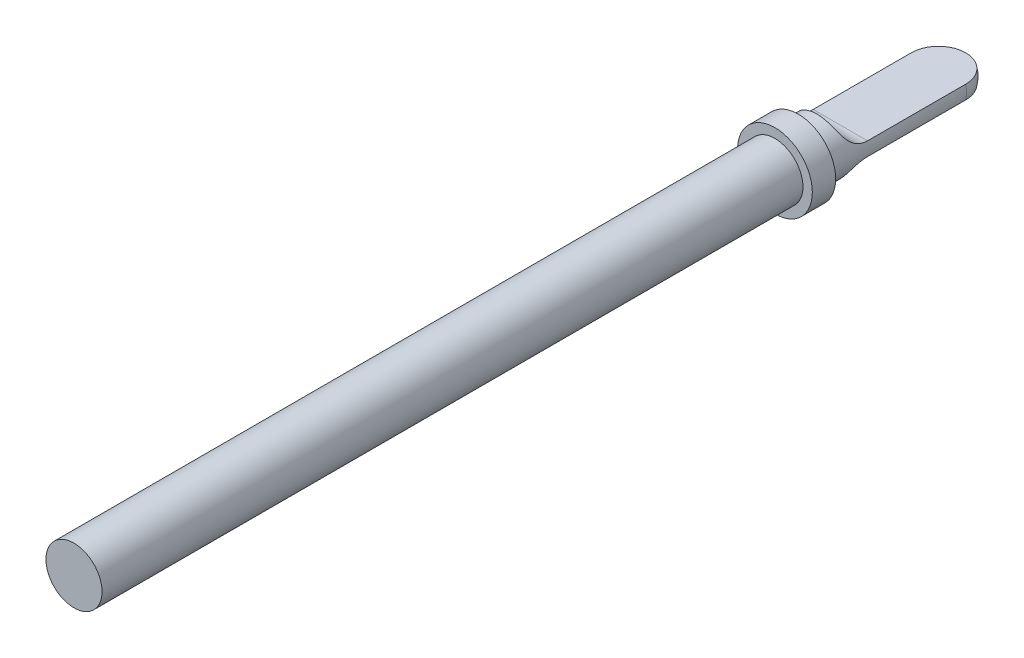
ISO-10303-21;
HEADER;
FILE_DESCRIPTION(('STEP AP214'),'2;1');
FILE_NAME('part.step','',(''),(''),'','','');
FILE_SCHEMA(('AUTOMOTIVE_DESIGN { 1 0 10303 214 1 1 1 1 }'));
ENDSEC;
DATA;
#1=APPLICATION_CONTEXT('core data for automotive mechanical design processes');
#2=APPLICATION_PROTOCOL_DEFINITION('international standard','automotive_design',2000,#1);
#3=PRODUCT_CONTEXT('',#1,'mechanical');
#4=PRODUCT('Part','Part','',(#3));
#5=PRODUCT_RELATED_PRODUCT_CATEGORY('part','',(#4));
#6=PRODUCT_DEFINITION_FORMATION('','',#4);
#7=PRODUCT_DEFINITION_CONTEXT('part definition',#1,'design');
#8=PRODUCT_DEFINITION('design','',#6,#7);
#9=PRODUCT_DEFINITION_SHAPE('','',#8);
#10=(LENGTH_UNIT() NAMED_UNIT(*) SI_UNIT(.MILLI.,.METRE.));
#11=(NAMED_UNIT(*) PLANE_ANGLE_UNIT() SI_UNIT($,.RADIAN.));
#12=(NAMED_UNIT(*) SI_UNIT($,.STERADIAN.) SOLID_ANGLE_UNIT());
#13=UNCERTAINTY_MEASURE_WITH_UNIT(LENGTH_MEASURE(1.E-05),#10,'distance_accuracy_value','');
#14=(GEOMETRIC_REPRESENTATION_CONTEXT(3) GLOBAL_UNCERTAINTY_ASSIGNED_CONTEXT((#13)) GLOBAL_UNIT_ASSIGNED_CONTEXT((#10,
#11,#12)) REPRESENTATION_CONTEXT('',''));
#15=CARTESIAN_POINT('',(0.,0.,0.));
#16=DIRECTION('',(0.,0.,1.));
#17=DIRECTION('',(1.,0.,0.));
#18=AXIS2_PLACEMENT_3D('',#15,#16,#17);
#19=CARTESIAN_POINT('',(0.,0.,-35.));
#20=DIRECTION('',(0.,0.,1.));
#21=DIRECTION('',(1.,0.,0.));
#22=AXIS2_PLACEMENT_3D('',#19,#20,#21);
#23=CYLINDRICAL_SURFACE('',#22,6.);
#24=CARTESIAN_POINT('',(0.,0.,-5.));
#25=DIRECTION('',(0.,0.,-1.));
#26=DIRECTION('',(-1.,0.,0.));
#27=AXIS2_PLACEMENT_3D('',#24,#25,#26);
#28=CIRCLE('',#27,6.);
#29=CARTESIAN_POINT('',(-6.,0.,-5.));
#30=VERTEX_POINT('',#29);
#31=EDGE_CURVE('E100',#30,#30,#28,.T.);
#32=ORIENTED_EDGE('',*,*,#31,.T.);
#33=EDGE_LOOP('',(#32));
#34=FACE_BOUND('',#33,.T.);
#35=DIRECTION('',(0.,0.,1.));
#36=VECTOR('',#35,1.);
#37=CARTESIAN_POINT('',(-5.81878883365728,1.46345362389977,-35.));
#38=LINE('',#37,#36);
#39=CARTESIAN_POINT('',(-5.81878883365728,1.46345362389977,-35.));
#40=VERTEX_POINT('',#39);
#41=CARTESIAN_POINT('',(-5.81878883365728,1.46345362389977,-14.));
#42=VERTEX_POINT('',#41);
#43=EDGE_CURVE('E110',#40,#42,#38,.T.);
#44=ORIENTED_EDGE('',*,*,#43,.F.);
#45=CARTESIAN_POINT('',(0.,0.,-35.));
#46=DIRECTION('',(0.,0.,-1.));
#47=DIRECTION('',(-1.,0.,0.));
#48=AXIS2_PLACEMENT_3D('',#45,#46,#47);
#49=CIRCLE('',#48,6.);
#50=CARTESIAN_POINT('',(-5.81878883365728,-1.46345362389977,-35.));
#51=VERTEX_POINT('',#50);
#52=EDGE_CURVE('E105',#51,#40,#49,.T.);
#53=ORIENTED_EDGE('',*,*,#52,.F.);
#54=DIRECTION('',(0.,0.,1.));
#55=VECTOR('',#54,1.);
#56=CARTESIAN_POINT('',(-5.81878883365728,-1.46345362389977,-35.));
#57=LINE('',#56,#55);
#58=CARTESIAN_POINT('',(-5.81878883365728,-1.46345362389977,-14.));
#59=VERTEX_POINT('',#58);
#60=EDGE_CURVE('E91',#51,#59,#57,.T.);
#61=ORIENTED_EDGE('',*,*,#60,.T.);
#62=CARTESIAN_POINT('',(-5.81878883365728,-1.46345362389977,-14.));
#63=CARTESIAN_POINT('',(-5.8187595476493,-1.46343780822699,-13.8666701122302));
#64=CARTESIAN_POINT('',(-5.81744658980762,-1.46878605701894,-13.7333389597626));
#65=CARTESIAN_POINT('',(-5.8120416416793,-1.49009946165884,-13.4675723092326));
#66=CARTESIAN_POINT('',(-5.80794939032216,-1.50606561488737,-13.3351368964912));
#67=CARTESIAN_POINT('',(-5.7967633962931,-1.54854418566397,-13.0718335312319));
#68=CARTESIAN_POINT('',(-5.78966392303702,-1.57507673280462,-12.9409690644975));
#69=CARTESIAN_POINT('',(-5.7720500693881,-1.6384524111705,-12.6819979503359));
#70=CARTESIAN_POINT('',(-5.76153582113528,-1.6752951434195,-12.5538911963992));
#71=CARTESIAN_POINT('',(-5.73652900901838,-1.75901776550554,-12.3011679838563));
#72=CARTESIAN_POINT('',(-5.72203018657739,-1.80591341977891,-12.17655735882));
#73=CARTESIAN_POINT('',(-5.68839211428598,-1.90922627106087,-11.93199837499));
#74=CARTESIAN_POINT('',(-5.66925313696443,-1.96564290881716,-11.8120497428647));
#75=CARTESIAN_POINT('',(-5.62560218144598,-2.08728730869278,-11.5779034359227));
#76=CARTESIAN_POINT('',(-5.60109655250726,-2.1525046240722,-11.4636991596871));
#77=CARTESIAN_POINT('',(-5.54590059206869,-2.29096864146265,-11.2418369515879));
#78=CARTESIAN_POINT('',(-5.51521061451099,-2.36421488385344,-11.1341786455446));
#79=CARTESIAN_POINT('',(-5.44817088347328,-2.51474779026046,-10.9302832552103));
#80=CARTESIAN_POINT('',(-5.41208287611321,-2.59177231269134,-10.8337666777137));
#81=CARTESIAN_POINT('',(-5.33283342342227,-2.75114577746289,-10.6483265680489));
#82=CARTESIAN_POINT('',(-5.28967219576762,-2.83349455590399,-10.5594028023422));
#83=CARTESIAN_POINT('',(-5.19579614800294,-3.00216767013363,-10.3897643360033));
#84=CARTESIAN_POINT('',(-5.14508446283719,-3.08849034573572,-10.3090462516741));
#85=CARTESIAN_POINT('',(-5.03577426401779,-3.26368373781016,-10.1561754622725));
#86=CARTESIAN_POINT('',(-4.97717620507416,-3.35255430714454,-10.0840222638196));
#87=CARTESIAN_POINT('',(-4.85666277825761,-3.52463093509877,-9.95350746791766));
#88=CARTESIAN_POINT('',(-4.79532149416031,-3.60776466918889,-9.8945184345673));
#89=CARTESIAN_POINT('',(-4.66586998095938,-3.7736888376187,-9.78394668237212));
#90=CARTESIAN_POINT('',(-4.59775953551006,-3.85647926089785,-9.73236420037319));
#91=CARTESIAN_POINT('',(-4.45498666796435,-4.02056245384197,-9.63636369761515));
#92=CARTESIAN_POINT('',(-4.38032338451525,-4.10185502491397,-9.59194662091345));
#93=CARTESIAN_POINT('',(-4.22479167079789,-4.26187589406231,-9.50988380364833));
#94=CARTESIAN_POINT('',(-4.14392297487824,-4.34060408215263,-9.47223835320667));
#95=CARTESIAN_POINT('',(-3.9742843872052,-4.49651748216085,-9.40232150720246));
#96=CARTESIAN_POINT('',(-3.88536616550119,-4.57361298322587,-9.37021054087888));
#97=CARTESIAN_POINT('',(-3.70194301399493,-4.72330798115938,-9.31189272290486));
#98=CARTESIAN_POINT('',(-3.6074362141302,-4.79590595622523,-9.28568786184329));
#99=CARTESIAN_POINT('',(-3.41338767390328,-4.93589921722036,-9.23848379784218));
#100=CARTESIAN_POINT('',(-3.31384510941901,-5.00329364698083,-9.2174854503083));
#101=CARTESIAN_POINT('',(-3.11027601245632,-5.132320188033,-9.17997941120446));
#102=CARTESIAN_POINT('',(-3.0062489567153,-5.19395162420962,-9.16347224532967));
#103=CARTESIAN_POINT('',(-2.77836250777054,-5.31978216342244,-9.13206092112397));
#104=CARTESIAN_POINT('',(-2.65386668958833,-5.38298276780505,-9.11776736555843));
#105=CARTESIAN_POINT('',(-2.40048371276678,-5.50065366533524,-9.09320590147829));
#106=CARTESIAN_POINT('',(-2.27159766021798,-5.55512613803728,-9.08293698701717));
#107=CARTESIAN_POINT('',(-2.01004063255206,-5.65502879146923,-9.0655270167213));
#108=CARTESIAN_POINT('',(-1.87736656855546,-5.70045133699281,-9.05838859596234));
#109=CARTESIAN_POINT('',(-1.60910641984213,-5.78190495866832,-9.04649783482034));
#110=CARTESIAN_POINT('',(-1.47352107373874,-5.81793838713376,-9.04174489651073));
#111=CARTESIAN_POINT('',(-1.17868291766821,-5.88532162571004,-9.03340174720549));
#112=CARTESIAN_POINT('',(-1.01904953816999,-5.91505370174966,-9.03011027979797));
#113=CARTESIAN_POINT('',(-0.697864120472235,-5.96148651372896,-9.02520626129384));
#114=CARTESIAN_POINT('',(-0.536311886958795,-5.97818591137274,-9.02359388261332));
#115=CARTESIAN_POINT('',(-0.212352306735517,-5.99843723228969,-9.0216605093019));
#116=CARTESIAN_POINT('',(-0.0499448347250323,-6.00198717216268,-9.02133970948581));
#117=CARTESIAN_POINT('',(0.274616681506203,-5.99590941687564,-9.02190684393316));
#118=CARTESIAN_POINT('',(0.436770732256608,-5.98628206703863,-9.02279474652143));
#119=CARTESIAN_POINT('',(0.759907943791363,-5.95390051824042,-9.02600560519936));
#120=CARTESIAN_POINT('',(0.920889822971323,-5.93113365470752,-9.02832994595883));
#121=CARTESIAN_POINT('',(1.24044158965079,-5.87262195631735,-9.03494371178069));
#122=CARTESIAN_POINT('',(1.39901144000606,-5.83687692181202,-9.03923316707344));
#123=CARTESIAN_POINT('',(1.71272981344262,-5.75264707092209,-9.05060003167963));
#124=CARTESIAN_POINT('',(1.8678763600085,-5.70415509320659,-9.05767900928745));
#125=CARTESIAN_POINT('',(2.1735328773002,-5.59482766528365,-9.07571763100907));
#126=CARTESIAN_POINT('',(2.32404289369875,-5.53399233671079,-9.08667723688295));
#127=CARTESIAN_POINT('',(2.62006564342765,-5.40016476381594,-9.11388670940911));
#128=CARTESIAN_POINT('',(2.76554692167828,-5.32710850571574,-9.13016488702874));
#129=CARTESIAN_POINT('',(3.04942395807997,-5.16984884709139,-9.16955967835561));
#130=CARTESIAN_POINT('',(3.18781918641801,-5.08564461473328,-9.19267680252702));
#131=CARTESIAN_POINT('',(3.45597979395715,-4.90734969104094,-9.24739877908202));
#132=CARTESIAN_POINT('',(3.58575991782219,-4.81327664172622,-9.27898863742804));
#133=CARTESIAN_POINT('',(3.8356140116889,-4.61663369821595,-9.35239285945292));
#134=CARTESIAN_POINT('',(3.95569163160214,-4.5140670288492,-9.39420335425755));
#135=CARTESIAN_POINT('',(4.15580633337852,-4.32930064709152,-9.4775124824593));
#136=CARTESIAN_POINT('',(4.23827134391691,-4.24853801054734,-9.516397439464));
#137=CARTESIAN_POINT('',(4.39666530785829,-4.08440078826694,-9.6012912680492));
#138=CARTESIAN_POINT('',(4.47259561027413,-4.00102674649496,-9.6472986637716));
#139=CARTESIAN_POINT('',(4.61753068381744,-3.83284866469934,-9.74682969433852));
#140=CARTESIAN_POINT('',(4.68653927924195,-3.74804544489974,-9.80034913905707));
#141=CARTESIAN_POINT('',(4.8174580502294,-3.57821108638931,-9.9151646636549));
#142=CARTESIAN_POINT('',(4.87936800977979,-3.4931799408232,-9.97646098006606));
#143=CARTESIAN_POINT('',(4.99614079069991,-3.32402813761256,-10.1070008813791));
#144=CARTESIAN_POINT('',(5.0509890871957,-3.23990967248142,-10.1762603087263));
#145=CARTESIAN_POINT('',(5.15360350544139,-3.0740660971724,-10.3224639820535));
#146=CARTESIAN_POINT('',(5.20136960122366,-2.99234099577092,-10.399408256209));
#147=CARTESIAN_POINT('',(5.29011260675096,-2.83250244264892,-10.560656399736));
#148=CARTESIAN_POINT('',(5.33108772238632,-2.7543899492607,-10.6449622049975));
#149=CARTESIAN_POINT('',(5.40665943484755,-2.60292150229982,-10.8204207839128));
#150=CARTESIAN_POINT('',(5.44125604895894,-2.52956553583748,-10.9115735390106));
#151=CARTESIAN_POINT('',(5.50371918881503,-2.39054843839731,-11.0974939736224));
#152=CARTESIAN_POINT('',(5.53174625221858,-2.32472994892401,-11.1920903884363));
#153=CARTESIAN_POINT('',(5.58282545114633,-2.19923908896156,-11.3865970913035));
#154=CARTESIAN_POINT('',(5.60587593944137,-2.13956875689723,-11.4865091252109));
#155=CARTESIAN_POINT('',(5.64755823313451,-2.02699089414612,-11.6910112231334));
#156=CARTESIAN_POINT('',(5.66618810553045,-1.97408632656898,-11.7956033099225));
#157=CARTESIAN_POINT('',(5.69955978301773,-1.87555975284567,-12.0087644753518));
#158=CARTESIAN_POINT('',(5.7143013297986,-1.82993823060847,-12.1173338176648));
#159=CARTESIAN_POINT('',(5.7413215459172,-1.74339558985883,-12.3456145698158));
#160=CARTESIAN_POINT('',(5.75335086452186,-1.70303860575969,-12.4655696047224));
#161=CARTESIAN_POINT('',(5.77404740178338,-1.63149122788247,-12.7084269372314));
#162=CARTESIAN_POINT('',(5.78271551444739,-1.60029839717603,-12.83132844189));
#163=CARTESIAN_POINT('',(5.79710780506332,-1.54735023160823,-13.0791498711213));
#164=CARTESIAN_POINT('',(5.8028356429596,-1.52558316921042,-13.2040670857523));
#165=CARTESIAN_POINT('',(5.81166286905493,-1.49160497745279,-13.4552363242254));
#166=CARTESIAN_POINT('',(5.81476362540547,-1.47938887432804,-13.5814876185656));
#167=CARTESIAN_POINT('',(5.81735581137501,-1.46914140065543,-13.7566440574865));
#168=CARTESIAN_POINT('',(5.8178940785192,-1.46700732710797,-13.8053222658199));
#169=CARTESIAN_POINT('',(5.81861022337276,-1.46416439009828,-13.902665390686));
#170=CARTESIAN_POINT('',(5.8187885259947,-1.4634538462678,-13.9513302550095));
#171=CARTESIAN_POINT('',(5.81878883365728,-1.46345362389977,-14.));
#172=B_SPLINE_CURVE_WITH_KNOTS('',3,(#62,#63,#64,#65,#66,#67,#68,#69,#70,#71,#72,#73,#74,#75,
#76,#77,#78,#79,#80,#81,#82,#83,#84,#85,#86,#87,#88,#89,#90,#91,#92,#93,#94,#95,#96,#97,#98,#99,
#100,#101,#102,#103,#104,#105,#106,#107,#108,#109,#110,#111,#112,#113,#114,#115,#116,#117,#118,
#119,#120,#121,#122,#123,#124,#125,#126,#127,#128,#129,#130,#131,#132,#133,#134,#135,#136,#137,
#138,#139,#140,#141,#142,#143,#144,#145,#146,#147,#148,#149,#150,#151,#152,#153,#154,#155,#156,
#157,#158,#159,#160,#161,#162,#163,#164,#165,#166,#167,#168,#169,#170,#171),.UNSPECIFIED.,.F.,
.F.,(4,2,2,2,2,2,2,2,2,2,2,2,2,2,2,2,2,2,2,2,2,2,2,2,2,2,2,2,2,2,2,2,2,2,2,2,2,2,2,2,2,2,2,2,2,
2,2,2,2,2,2,2,2,2,4),(0.,0.399878365913476,0.799794299245237,1.20047576828578,1.60114173418282,
2.00244065947904,2.40371602110869,2.80451917626255,3.20529939919484,3.59073184689297,
3.97615243525059,4.36141344123577,4.7466522434744,5.10313610446917,5.459631362528,
5.81617355130375,6.17273101204157,6.5383274557819,6.9040469361936,7.26982646283964,
7.63564878577071,8.05627412894518,8.4767942709733,8.89766770725366,9.3184355979059,
9.80511185077942,10.2918380727494,10.7786377071438,11.2654245847494,11.752681439243,
12.2399457897087,12.7274844762878,13.2150183587669,13.7051908764367,14.1953999901897,
14.6847472495922,15.173909559723,15.5389311963448,15.9038772969228,16.2686206382014,
16.6333750757302,16.9988681684641,17.364362601284,17.7299534407187,18.0955432893998,
18.4509561331187,18.8064864375166,19.1621719192958,19.5178810241356,19.8988590814439,
20.2797357373158,20.6601371354383,21.0403403032412,21.1865068998496,21.3325008560391),.UNSPECIFIED.);
#173=CARTESIAN_POINT('',(5.81878883365728,-1.46345362389977,-14.));
#174=VERTEX_POINT('',#173);
#175=EDGE_CURVE('E11',#59,#174,#172,.T.);
#176=ORIENTED_EDGE('',*,*,#175,.T.);
#177=DIRECTION('',(0.,0.,1.));
#178=VECTOR('',#177,1.);
#179=CARTESIAN_POINT('',(5.81878883365728,-1.46345362389977,-35.));
#180=LINE('',#179,#178);
#181=CARTESIAN_POINT('',(5.81878883365728,-1.46345362389977,-35.));
#182=VERTEX_POINT('',#181);
#183=EDGE_CURVE('E84',#174,#182,#180,.F.);
#184=ORIENTED_EDGE('',*,*,#183,.T.);
#185=CARTESIAN_POINT('',(5.81878883365728,1.46345362389977,-35.));
#186=VERTEX_POINT('',#185);
#187=EDGE_CURVE('E89',#186,#182,#49,.T.);
#188=ORIENTED_EDGE('',*,*,#187,.F.);
#189=DIRECTION('',(0.,0.,1.));
#190=VECTOR('',#189,1.);
#191=CARTESIAN_POINT('',(5.81878883365728,1.46345362389977,-35.));
#192=LINE('',#191,#190);
#193=CARTESIAN_POINT('',(5.81878883365728,1.46345362389977,-14.));
#194=VERTEX_POINT('',#193);
#195=EDGE_CURVE('E180',#194,#186,#192,.F.);
#196=ORIENTED_EDGE('',*,*,#195,.F.);
#197=CARTESIAN_POINT('',(5.81878883365728,1.46345362389977,-14.));
#198=CARTESIAN_POINT('',(5.8187595476493,1.46343780822699,-13.8666701122302));
#199=CARTESIAN_POINT('',(5.81744658980762,1.46878605701894,-13.7333389597626));
#200=CARTESIAN_POINT('',(5.8120416416793,1.49009946165884,-13.4675723092326));
#201=CARTESIAN_POINT('',(5.80794939032216,1.50606561488737,-13.3351368964912));
#202=CARTESIAN_POINT('',(5.7967633962931,1.54854418566397,-13.0718335312319));
#203=CARTESIAN_POINT('',(5.78966392303702,1.57507673280462,-12.9409690644975));
#204=CARTESIAN_POINT('',(5.7720500693881,1.6384524111705,-12.6819979503359));
#205=CARTESIAN_POINT('',(5.76153582113528,1.6752951434195,-12.5538911963992));
#206=CARTESIAN_POINT('',(5.73652900901838,1.75901776550554,-12.3011679838563));
#207=CARTESIAN_POINT('',(5.72203018657739,1.80591341977891,-12.17655735882));
#208=CARTESIAN_POINT('',(5.68839211428598,1.90922627106087,-11.93199837499));
#209=CARTESIAN_POINT('',(5.66925313696443,1.96564290881716,-11.8120497428647));
#210=CARTESIAN_POINT('',(5.62560218144598,2.08728730869278,-11.5779034359227));
#211=CARTESIAN_POINT('',(5.60109655250726,2.1525046240722,-11.4636991596871));
#212=CARTESIAN_POINT('',(5.54590059206869,2.29096864146265,-11.2418369515879));
#213=CARTESIAN_POINT('',(5.51521061451099,2.36421488385344,-11.1341786455446));
#214=CARTESIAN_POINT('',(5.44817088347328,2.51474779026046,-10.9302832552103));
#215=CARTESIAN_POINT('',(5.41208287611321,2.59177231269134,-10.8337666777137));
#216=CARTESIAN_POINT('',(5.33283342342227,2.75114577746289,-10.6483265680489));
#217=CARTESIAN_POINT('',(5.28967219576762,2.83349455590399,-10.5594028023422));
#218=CARTESIAN_POINT('',(5.19579614800294,3.00216767013363,-10.3897643360033));
#219=CARTESIAN_POINT('',(5.14508446283719,3.08849034573572,-10.3090462516741));
#220=CARTESIAN_POINT('',(5.03577426401779,3.26368373781016,-10.1561754622725));
#221=CARTESIAN_POINT('',(4.97717620507416,3.35255430714454,-10.0840222638196));
#222=CARTESIAN_POINT('',(4.85666277825761,3.52463093509877,-9.95350746791767));
#223=CARTESIAN_POINT('',(4.79532149416031,3.60776466918889,-9.89451843456731));
#224=CARTESIAN_POINT('',(4.66586998095938,3.7736888376187,-9.78394668237213));
#225=CARTESIAN_POINT('',(4.59775953551006,3.85647926089785,-9.73236420037319));
#226=CARTESIAN_POINT('',(4.45498666796435,4.02056245384197,-9.63636369761515));
#227=CARTESIAN_POINT('',(4.38032338451525,4.10185502491397,-9.59194662091345));
#228=CARTESIAN_POINT('',(4.22479167079789,4.26187589406231,-9.50988380364833));
#229=CARTESIAN_POINT('',(4.14392297487824,4.34060408215263,-9.47223835320667));
#230=CARTESIAN_POINT('',(3.9742843872052,4.49651748216085,-9.40232150720246));
#231=CARTESIAN_POINT('',(3.88536616550119,4.57361298322587,-9.37021054087889));
#232=CARTESIAN_POINT('',(3.70194301399492,4.72330798115938,-9.31189272290486));
#233=CARTESIAN_POINT('',(3.6074362141302,4.79590595622523,-9.28568786184329));
#234=CARTESIAN_POINT('',(3.41338767390328,4.93589921722036,-9.23848379784218));
#235=CARTESIAN_POINT('',(3.31384510941901,5.00329364698083,-9.21748545030831));
#236=CARTESIAN_POINT('',(3.11027601245632,5.132320188033,-9.17997941120446));
#237=CARTESIAN_POINT('',(3.0062489567153,5.19395162420962,-9.16347224532968));
#238=CARTESIAN_POINT('',(2.77836250777054,5.31978216342244,-9.13206092112397));
#239=CARTESIAN_POINT('',(2.65386668958833,5.38298276780505,-9.11776736555843));
#240=CARTESIAN_POINT('',(2.40048371276678,5.50065366533524,-9.09320590147829));
#241=CARTESIAN_POINT('',(2.27159766021798,5.55512613803728,-9.08293698701717));
#242=CARTESIAN_POINT('',(2.01004063255206,5.65502879146923,-9.0655270167213));
#243=CARTESIAN_POINT('',(1.87736656855546,5.70045133699281,-9.05838859596234));
#244=CARTESIAN_POINT('',(1.60910641984213,5.78190495866832,-9.04649783482034));
#245=CARTESIAN_POINT('',(1.47352107373874,5.81793838713376,-9.04174489651074));
#246=CARTESIAN_POINT('',(1.17868291766821,5.88532162571004,-9.0334017472055));
#247=CARTESIAN_POINT('',(1.01904953816999,5.91505370174966,-9.03011027979797));
#248=CARTESIAN_POINT('',(0.697864120472234,5.96148651372896,-9.02520626129384));
#249=CARTESIAN_POINT('',(0.536311886958793,5.97818591137274,-9.02359388261333));
#250=CARTESIAN_POINT('',(0.212352306735515,5.99843723228969,-9.0216605093019));
#251=CARTESIAN_POINT('',(0.0499448347250316,6.00198717216268,-9.02133970948582));
#252=CARTESIAN_POINT('',(-0.274616681506204,5.99590941687564,-9.02190684393317));
#253=CARTESIAN_POINT('',(-0.436770732256609,5.98628206703863,-9.02279474652144));
#254=CARTESIAN_POINT('',(-0.759907943791364,5.95390051824042,-9.02600560519936));
#255=CARTESIAN_POINT('',(-0.920889822971324,5.93113365470752,-9.02832994595883));
#256=CARTESIAN_POINT('',(-1.2404415896508,5.87262195631735,-9.03494371178069));
#257=CARTESIAN_POINT('',(-1.39901144000606,5.83687692181202,-9.03923316707345));
#258=CARTESIAN_POINT('',(-1.71272981344262,5.75264707092209,-9.05060003167963));
#259=CARTESIAN_POINT('',(-1.86787636000851,5.70415509320659,-9.05767900928745));
#260=CARTESIAN_POINT('',(-2.1735328773002,5.59482766528364,-9.07571763100908));
#261=CARTESIAN_POINT('',(-2.32404289369875,5.53399233671079,-9.08667723688296));
#262=CARTESIAN_POINT('',(-2.62006564342765,5.40016476381594,-9.11388670940911));
#263=CARTESIAN_POINT('',(-2.76554692167828,5.32710850571574,-9.13016488702874));
#264=CARTESIAN_POINT('',(-3.04942395807997,5.16984884709139,-9.16955967835561));
#265=CARTESIAN_POINT('',(-3.18781918641802,5.08564461473328,-9.19267680252702));
#266=CARTESIAN_POINT('',(-3.45597979395716,4.90734969104093,-9.24739877908203));
#267=CARTESIAN_POINT('',(-3.5857599178222,4.81327664172622,-9.27898863742805));
#268=CARTESIAN_POINT('',(-3.8356140116889,4.61663369821594,-9.35239285945292));
#269=CARTESIAN_POINT('',(-3.95569163160214,4.5140670288492,-9.39420335425756));
#270=CARTESIAN_POINT('',(-4.15580633337852,4.32930064709152,-9.4775124824593));
#271=CARTESIAN_POINT('',(-4.23827134391691,4.24853801054734,-9.516397439464));
#272=CARTESIAN_POINT('',(-4.39666530785829,4.08440078826694,-9.60129126804921));
#273=CARTESIAN_POINT('',(-4.47259561027413,4.00102674649496,-9.64729866377161));
#274=CARTESIAN_POINT('',(-4.61753068381744,3.83284866469934,-9.74682969433852));
#275=CARTESIAN_POINT('',(-4.68653927924195,3.74804544489974,-9.80034913905707));
#276=CARTESIAN_POINT('',(-4.8174580502294,3.5782110863893,-9.91516466365491));
#277=CARTESIAN_POINT('',(-4.87936800977979,3.49317994082319,-9.97646098006606));
#278=CARTESIAN_POINT('',(-4.99614079069991,3.32402813761256,-10.1070008813791));
#279=CARTESIAN_POINT('',(-5.0509890871957,3.23990967248141,-10.1762603087263));
#280=CARTESIAN_POINT('',(-5.15360350544139,3.07406609717239,-10.3224639820535));
#281=CARTESIAN_POINT('',(-5.20136960122366,2.99234099577092,-10.399408256209));
#282=CARTESIAN_POINT('',(-5.29011260675096,2.83250244264892,-10.560656399736));
#283=CARTESIAN_POINT('',(-5.33108772238633,2.7543899492607,-10.6449622049975));
#284=CARTESIAN_POINT('',(-5.40665943484755,2.60292150229982,-10.8204207839128));
#285=CARTESIAN_POINT('',(-5.44125604895894,2.52956553583748,-10.9115735390106));
#286=CARTESIAN_POINT('',(-5.50371918881503,2.39054843839731,-11.0974939736224));
#287=CARTESIAN_POINT('',(-5.53174625221858,2.32472994892401,-11.1920903884363));
#288=CARTESIAN_POINT('',(-5.58282545114633,2.19923908896156,-11.3865970913035));
#289=CARTESIAN_POINT('',(-5.60587593944137,2.13956875689723,-11.4865091252109));
#290=CARTESIAN_POINT('',(-5.6475582331345,2.02699089414612,-11.6910112231334));
#291=CARTESIAN_POINT('',(-5.66618810553045,1.97408632656898,-11.7956033099225));
#292=CARTESIAN_POINT('',(-5.69955978301773,1.87555975284567,-12.0087644753518));
#293=CARTESIAN_POINT('',(-5.7143013297986,1.82993823060847,-12.1173338176648));
#294=CARTESIAN_POINT('',(-5.7413215459172,1.74339558985883,-12.3456145698158));
#295=CARTESIAN_POINT('',(-5.75335086452186,1.70303860575969,-12.4655696047224));
#296=CARTESIAN_POINT('',(-5.77404740178338,1.63149122788247,-12.7084269372314));
#297=CARTESIAN_POINT('',(-5.78271551444739,1.60029839717603,-12.83132844189));
#298=CARTESIAN_POINT('',(-5.79710780506332,1.54735023160823,-13.0791498711213));
#299=CARTESIAN_POINT('',(-5.8028356429596,1.52558316921042,-13.2040670857523));
#300=CARTESIAN_POINT('',(-5.81166286905493,1.49160497745279,-13.4552363242254));
#301=CARTESIAN_POINT('',(-5.81476362540547,1.47938887432804,-13.5814876185656));
#302=CARTESIAN_POINT('',(-5.81735581137501,1.46914140065543,-13.7566440574865));
#303=CARTESIAN_POINT('',(-5.8178940785192,1.46700732710797,-13.8053222658199));
#304=CARTESIAN_POINT('',(-5.81861022337276,1.46416439009828,-13.902665390686));
#305=CARTESIAN_POINT('',(-5.8187885259947,1.4634538462678,-13.9513302550095));
#306=CARTESIAN_POINT('',(-5.81878883365728,1.46345362389976,-14.));
#307=B_SPLINE_CURVE_WITH_KNOTS('',3,(#197,#198,#199,#200,#201,#202,#203,#204,#205,#206,#207,
#208,#209,#210,#211,#212,#213,#214,#215,#216,#217,#218,#219,#220,#221,#222,#223,#224,#225,#226,
#227,#228,#229,#230,#231,#232,#233,#234,#235,#236,#237,#238,#239,#240,#241,#242,#243,#244,#245,
#246,#247,#248,#249,#250,#251,#252,#253,#254,#255,#256,#257,#258,#259,#260,#261,#262,#263,#264,
#265,#266,#267,#268,#269,#270,#271,#272,#273,#274,#275,#276,#277,#278,#279,#280,#281,#282,#283,
#284,#285,#286,#287,#288,#289,#290,#291,#292,#293,#294,#295,#296,#297,#298,#299,#300,#301,#302,
#303,#304,#305,#306),.UNSPECIFIED.,.F.,.F.,(4,2,2,2,2,2,2,2,2,2,2,2,2,2,2,2,2,2,2,2,2,2,2,2,2,2,
2,2,2,2,2,2,2,2,2,2,2,2,2,2,2,2,2,2,2,2,2,2,2,2,2,2,2,2,4),(0.,0.399878365913476,
0.799794299245237,1.20047576828578,1.60114173418282,2.00244065947904,2.40371602110869,
2.80451917626255,3.20529939919484,3.59073184689297,3.97615243525059,4.36141344123577,
4.7466522434744,5.10313610446917,5.459631362528,5.81617355130375,6.17273101204157,
6.5383274557819,6.9040469361936,7.26982646283964,7.63564878577071,8.05627412894518,
8.4767942709733,8.89766770725366,9.3184355979059,9.80511185077942,10.2918380727494,
10.7786377071438,11.2654245847494,11.752681439243,12.2399457897087,12.7274844762878,
13.2150183587669,13.7051908764367,14.1953999901897,14.6847472495922,15.173909559723,
15.5389311963448,15.9038772969228,16.2686206382014,16.6333750757302,16.9988681684641,
17.364362601284,17.7299534407187,18.0955432893998,18.4509561331187,18.8064864375166,
19.1621719192958,19.5178810241356,19.8988590814439,20.2797357373158,20.6601371354383,
21.0403403032412,21.1865068998497,21.3325008560391),.UNSPECIFIED.);
#308=EDGE_CURVE('E128',#194,#42,#307,.T.);
#309=ORIENTED_EDGE('',*,*,#308,.T.);
#310=EDGE_LOOP('',(#44,#53,#61,#176,#184,#188,#196,#309));
#311=FACE_BOUND('',#310,.T.);
#312=ADVANCED_FACE('F42',(#34,#311),#23,.T.);
#313=CARTESIAN_POINT('',(0.,0.,-35.));
#314=DIRECTION('',(0.,1.,0.));
#315=DIRECTION('',(-1.,0.,0.));
#316=AXIS2_PLACEMENT_3D('',#313,#314,#315);
#317=SPHERICAL_SURFACE('',#316,6.);
#318=CARTESIAN_POINT('',(0.,1.46345362389977,-35.));
#319=DIRECTION('',(0.,1.,0.));
#320=DIRECTION('',(0.,0.,1.));
#321=AXIS2_PLACEMENT_3D('',#318,#319,#320);
#322=CIRCLE('',#321,5.81878883365728);
#323=EDGE_CURVE('E99',#186,#40,#322,.T.);
#324=ORIENTED_EDGE('',*,*,#323,.F.);
#325=ORIENTED_EDGE('',*,*,#187,.T.);
#326=CARTESIAN_POINT('',(0.,-1.46345362389977,-35.));
#327=DIRECTION('',(0.,1.,0.));
#328=DIRECTION('',(0.,0.,1.));
#329=AXIS2_PLACEMENT_3D('',#326,#327,#328);
#330=CIRCLE('',#329,5.81878883365728);
#331=EDGE_CURVE('E94',#182,#51,#330,.T.);
#332=ORIENTED_EDGE('',*,*,#331,.T.);
#333=ORIENTED_EDGE('',*,*,#52,.T.);
#334=EDGE_LOOP('',(#324,#325,#332,#333));
#335=FACE_BOUND('',#334,.T.);
#336=ADVANCED_FACE('F103',(#335),#317,.T.);
#337=CARTESIAN_POINT('',(0.,0.,150.));
#338=DIRECTION('',(0.,0.,-1.));
#339=DIRECTION('',(-1.,0.,0.));
#340=AXIS2_PLACEMENT_3D('',#337,#338,#339);
#341=CYLINDRICAL_SURFACE('',#340,6.);
#342=CARTESIAN_POINT('',(0.,0.,150.));
#343=DIRECTION('',(0.,0.,1.));
#344=DIRECTION('',(1.,0.,0.));
#345=AXIS2_PLACEMENT_3D('',#342,#343,#344);
#346=CIRCLE('',#345,6.);
#347=CARTESIAN_POINT('',(6.,0.,150.));
#348=VERTEX_POINT('',#347);
#349=EDGE_CURVE('E116',#348,#348,#346,.T.);
#350=ORIENTED_EDGE('',*,*,#349,.F.);
#351=EDGE_LOOP('',(#350));
#352=FACE_BOUND('',#351,.T.);
#353=CARTESIAN_POINT('',(0.,0.,0.));
#354=DIRECTION('',(0.,0.,1.));
#355=DIRECTION('',(1.,0.,0.));
#356=AXIS2_PLACEMENT_3D('',#353,#354,#355);
#357=CIRCLE('',#356,6.);
#358=CARTESIAN_POINT('',(6.,0.,0.));
#359=VERTEX_POINT('',#358);
#360=EDGE_CURVE('E118',#359,#359,#357,.T.);
#361=ORIENTED_EDGE('',*,*,#360,.T.);
#362=EDGE_LOOP('',(#361));
#363=FACE_BOUND('',#362,.T.);
#364=ADVANCED_FACE('F142',(#352,#363),#341,.T.);
#365=CARTESIAN_POINT('',(0.,0.,150.));
#366=DIRECTION('',(0.,0.,1.));
#367=DIRECTION('',(1.,0.,0.));
#368=AXIS2_PLACEMENT_3D('',#365,#366,#367);
#369=PLANE('',#368);
#370=ORIENTED_EDGE('',*,*,#349,.T.);
#371=EDGE_LOOP('',(#370));
#372=FACE_BOUND('',#371,.T.);
#373=ADVANCED_FACE('F145',(#372),#369,.T.);
#374=CARTESIAN_POINT('',(0.,0.,-5.));
#375=DIRECTION('',(0.,0.,1.));
#376=DIRECTION('',(1.,0.,0.));
#377=AXIS2_PLACEMENT_3D('',#374,#375,#376);
#378=CYLINDRICAL_SURFACE('',#377,8.);
#379=CARTESIAN_POINT('',(0.,0.,-5.));
#380=DIRECTION('',(0.,0.,1.));
#381=DIRECTION('',(1.,0.,0.));
#382=AXIS2_PLACEMENT_3D('',#379,#380,#381);
#383=CIRCLE('',#382,8.);
#384=CARTESIAN_POINT('',(8.,0.,-5.));
#385=VERTEX_POINT('',#384);
#386=EDGE_CURVE('E108',#385,#385,#383,.T.);
#387=ORIENTED_EDGE('',*,*,#386,.T.);
#388=EDGE_LOOP('',(#387));
#389=FACE_BOUND('',#388,.T.);
#390=CARTESIAN_POINT('',(0.,0.,0.));
#391=DIRECTION('',(0.,0.,1.));
#392=DIRECTION('',(1.,0.,0.));
#393=AXIS2_PLACEMENT_3D('',#390,#391,#392);
#394=CIRCLE('',#393,8.);
#395=CARTESIAN_POINT('',(8.,0.,0.));
#396=VERTEX_POINT('',#395);
#397=EDGE_CURVE('E104',#396,#396,#394,.T.);
#398=ORIENTED_EDGE('',*,*,#397,.F.);
#399=EDGE_LOOP('',(#398));
#400=FACE_BOUND('',#399,.T.);
#401=ADVANCED_FACE('F149',(#389,#400),#378,.T.);
#402=CARTESIAN_POINT('',(0.,0.,-5.));
#403=DIRECTION('',(0.,0.,1.));
#404=DIRECTION('',(1.,0.,0.));
#405=AXIS2_PLACEMENT_3D('',#402,#403,#404);
#406=PLANE('',#405);
#407=ORIENTED_EDGE('',*,*,#31,.F.);
#408=EDGE_LOOP('',(#407));
#409=FACE_BOUND('',#408,.T.);
#410=ORIENTED_EDGE('',*,*,#386,.F.);
#411=EDGE_LOOP('',(#410));
#412=FACE_BOUND('',#411,.T.);
#413=ADVANCED_FACE('F153',(#409,#412),#406,.F.);
#414=CARTESIAN_POINT('',(0.,0.,0.));
#415=DIRECTION('',(0.,0.,1.));
#416=DIRECTION('',(1.,0.,0.));
#417=AXIS2_PLACEMENT_3D('',#414,#415,#416);
#418=PLANE('',#417);
#419=ORIENTED_EDGE('',*,*,#360,.F.);
#420=EDGE_LOOP('',(#419));
#421=FACE_BOUND('',#420,.T.);
#422=ORIENTED_EDGE('',*,*,#397,.T.);
#423=EDGE_LOOP('',(#422));
#424=FACE_BOUND('',#423,.T.);
#425=ADVANCED_FACE('F155',(#421,#424),#418,.T.);
#426=CARTESIAN_POINT('',(0.,-1.46345362389977,-49.));
#427=DIRECTION('',(0.,1.,0.));
#428=DIRECTION('',(0.,0.,1.));
#429=AXIS2_PLACEMENT_3D('',#426,#427,#428);
#430=PLANE('',#429);
#431=ORIENTED_EDGE('',*,*,#183,.F.);
#432=DIRECTION('',(-1.,0.,0.));
#433=VECTOR('',#432,1.);
#434=CARTESIAN_POINT('',(0.,-1.46345362389977,-14.));
#435=LINE('',#434,#433);
#436=EDGE_CURVE('E56',#174,#59,#435,.T.);
#437=ORIENTED_EDGE('',*,*,#436,.T.);
#438=ORIENTED_EDGE('',*,*,#60,.F.);
#439=ORIENTED_EDGE('',*,*,#331,.F.);
#440=EDGE_LOOP('',(#431,#437,#438,#439));
#441=FACE_BOUND('',#440,.T.);
#442=ADVANCED_FACE('F95',(#441),#430,.F.);
#443=CARTESIAN_POINT('',(0.,1.46345362389977,-49.));
#444=DIRECTION('',(0.,1.,0.));
#445=DIRECTION('',(0.,0.,1.));
#446=AXIS2_PLACEMENT_3D('',#443,#444,#445);
#447=PLANE('',#446);
#448=ORIENTED_EDGE('',*,*,#43,.T.);
#449=DIRECTION('',(-1.,0.,0.));
#450=VECTOR('',#449,1.);
#451=CARTESIAN_POINT('',(5.81878883365728,1.46345362389977,-14.));
#452=LINE('',#451,#450);
#453=EDGE_CURVE('E125',#42,#194,#452,.F.);
#454=ORIENTED_EDGE('',*,*,#453,.T.);
#455=ORIENTED_EDGE('',*,*,#195,.T.);
#456=ORIENTED_EDGE('',*,*,#323,.T.);
#457=EDGE_LOOP('',(#448,#454,#455,#456));
#458=FACE_BOUND('',#457,.T.);
#459=ADVANCED_FACE('F140',(#458),#447,.T.);
#460=CARTESIAN_POINT('',(0.,6.46345362389977,-14.));
#461=DIRECTION('',(1.,0.,0.));
#462=DIRECTION('',(0.,0.,-1.));
#463=AXIS2_PLACEMENT_3D('',#460,#461,#462);
#464=CYLINDRICAL_SURFACE('',#463,5.);
#465=ORIENTED_EDGE('',*,*,#308,.F.);
#466=ORIENTED_EDGE('',*,*,#453,.F.);
#467=EDGE_LOOP('',(#465,#466));
#468=FACE_BOUND('',#467,.T.);
#469=ADVANCED_FACE('F136',(#468),#464,.F.);
#470=CARTESIAN_POINT('',(0.,-6.46345362389977,-14.));
#471=DIRECTION('',(-1.,0.,0.));
#472=DIRECTION('',(0.,0.,1.));
#473=AXIS2_PLACEMENT_3D('',#470,#471,#472);
#474=CYLINDRICAL_SURFACE('',#473,5.);
#475=ORIENTED_EDGE('',*,*,#436,.F.);
#476=ORIENTED_EDGE('',*,*,#175,.F.);
#477=EDGE_LOOP('',(#475,#476));
#478=FACE_BOUND('',#477,.T.);
#479=ADVANCED_FACE('F44',(#478),#474,.F.);
#480=CLOSED_SHELL('',(#312,#336,#364,#373,#401,#413,#425,#442,#459,#469,#479));
#481=MANIFOLD_SOLID_BREP('B2',#480);
#482=ADVANCED_BREP_SHAPE_REPRESENTATION('',(#18,#481),#14);
#483=SHAPE_DEFINITION_REPRESENTATION(#9,#482);
ENDSEC;
END-ISO-10303-21;
